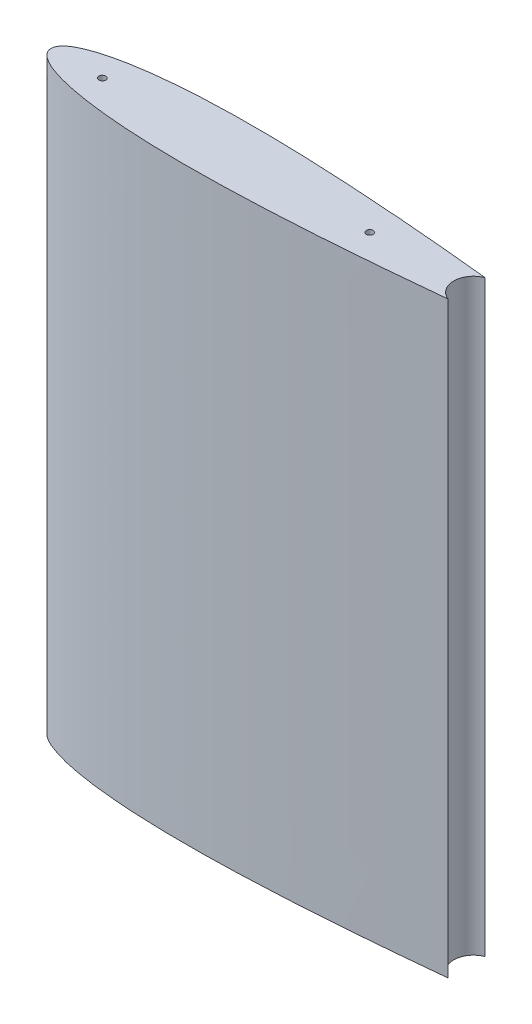
ISO-10303-21;
HEADER;
FILE_DESCRIPTION(('STEP AP214'),'2;1');
FILE_NAME('part.step','',(''),(''),'','','');
FILE_SCHEMA(('AUTOMOTIVE_DESIGN { 1 0 10303 214 1 1 1 1 }'));
ENDSEC;
DATA;
#1=APPLICATION_CONTEXT('core data for automotive mechanical design processes');
#2=APPLICATION_PROTOCOL_DEFINITION('international standard','automotive_design',2000,#1);
#3=PRODUCT_CONTEXT('',#1,'mechanical');
#4=PRODUCT('Part','Part','',(#3));
#5=PRODUCT_RELATED_PRODUCT_CATEGORY('part','',(#4));
#6=PRODUCT_DEFINITION_FORMATION('','',#4);
#7=PRODUCT_DEFINITION_CONTEXT('part definition',#1,'design');
#8=PRODUCT_DEFINITION('design','',#6,#7);
#9=PRODUCT_DEFINITION_SHAPE('','',#8);
#10=(LENGTH_UNIT() NAMED_UNIT(*) SI_UNIT(.MILLI.,.METRE.));
#11=(NAMED_UNIT(*) PLANE_ANGLE_UNIT() SI_UNIT($,.RADIAN.));
#12=(NAMED_UNIT(*) SI_UNIT($,.STERADIAN.) SOLID_ANGLE_UNIT());
#13=UNCERTAINTY_MEASURE_WITH_UNIT(LENGTH_MEASURE(1.E-05),#10,'distance_accuracy_value','');
#14=(GEOMETRIC_REPRESENTATION_CONTEXT(3) GLOBAL_UNCERTAINTY_ASSIGNED_CONTEXT((#13)) GLOBAL_UNIT_ASSIGNED_CONTEXT((#10,
#11,#12)) REPRESENTATION_CONTEXT('',''));
#15=CARTESIAN_POINT('',(0.,0.,0.));
#16=DIRECTION('',(0.,0.,1.));
#17=DIRECTION('',(1.,0.,0.));
#18=AXIS2_PLACEMENT_3D('',#15,#16,#17);
#19=CARTESIAN_POINT('',(0.,-210.,0.));
#20=DIRECTION('',(0.,1.,0.));
#21=DIRECTION('',(0.,0.,1.));
#22=AXIS2_PLACEMENT_3D('',#19,#20,#21);
#23=PLANE('',#22);
#24=CARTESIAN_POINT('',(121.386877654174,-210.,-0.000774738632431499));
#25=DIRECTION('',(0.,1.,0.));
#26=DIRECTION('',(0.,0.,1.));
#27=AXIS2_PLACEMENT_3D('',#24,#25,#26);
#28=CIRCLE('',#27,5.71427999999997);
#29=CARTESIAN_POINT('',(119.387912161681,-210.,5.35246100045289));
#30=VERTEX_POINT('',#29);
#31=CARTESIAN_POINT('',(119.387912161681,-210.,-5.35401047771775));
#32=VERTEX_POINT('',#31);
#33=EDGE_CURVE('E82',#30,#32,#28,.F.);
#34=ORIENTED_EDGE('',*,*,#33,.T.);
#35=CARTESIAN_POINT('',(119.387912161681,-210.,5.35246100045289));
#36=CARTESIAN_POINT('',(83.5761027363663,-210.,9.02159682580074));
#37=CARTESIAN_POINT('',(58.0526817065446,-210.,9.64630087542462));
#38=CARTESIAN_POINT('',(40.3562354993201,-210.,10.079434098306));
#39=CARTESIAN_POINT('',(27.3218192959385,-210.,9.03504536130809));
#40=CARTESIAN_POINT('',(18.4848690393656,-210.,8.32698056014109));
#41=CARTESIAN_POINT('',(12.0944974183857,-210.,6.97651459560746));
#42=CARTESIAN_POINT('',(7.68588439152702,-210.,6.04485017971873));
#43=CARTESIAN_POINT('',(4.71049001401734,-210.,4.86341025976879));
#44=CARTESIAN_POINT('',(-0.754275342115918,-210.,2.69351574302948));
#45=CARTESIAN_POINT('',(-0.755857509541158,-210.,-0.000774738632434628));
#46=CARTESIAN_POINT('',(-0.75743856577784,-210.,-2.69317296494548));
#47=CARTESIAN_POINT('',(4.71049001401745,-210.,-4.86495973703369));
#48=CARTESIAN_POINT('',(7.68309834672846,-210.,-6.04563928713539));
#49=CARTESIAN_POINT('',(12.0944974183858,-210.,-6.97806407287235));
#50=CARTESIAN_POINT('',(18.4819680110596,-210.,-8.32816543573486));
#51=CARTESIAN_POINT('',(27.3218192959386,-210.,-9.03659483857296));
#52=CARTESIAN_POINT('',(40.3533691178668,-210.,-10.0809487265388));
#53=CARTESIAN_POINT('',(58.0526817065449,-210.,-9.64785035268948));
#54=CARTESIAN_POINT('',(83.5741610565001,-210.,-9.02334523988835));
#55=CARTESIAN_POINT('',(119.387912161681,-210.,-5.35401047771775));
#56=B_SPLINE_CURVE_WITH_KNOTS('',2,(#35,#36,#37,#38,#39,#40,#41,#42,#43,#44,#45,#46,#47,#48,#49,
#50,#51,#52,#53,#54,#55),.UNSPECIFIED.,.F.,.F.,(3,2,2,2,2,2,2,2,2,2,3),(0.,0.25,0.375,0.4375,
0.46875,0.5,0.53125,0.5625,0.625,0.75,1.),.UNSPECIFIED.);
#57=EDGE_CURVE('E73',#32,#30,#56,.F.);
#58=ORIENTED_EDGE('',*,*,#57,.T.);
#59=EDGE_LOOP('',(#34,#58));
#60=FACE_BOUND('',#59,.T.);
#61=CARTESIAN_POINT('',(14.0832681871149,-210.,0.));
#62=DIRECTION('',(0.,1.,0.));
#63=DIRECTION('',(0.,0.,1.));
#64=AXIS2_PLACEMENT_3D('',#61,#62,#63);
#65=CIRCLE('',#64,1.);
#66=CARTESIAN_POINT('',(14.0832681871149,-210.,1.));
#67=VERTEX_POINT('',#66);
#68=EDGE_CURVE('E83',#67,#67,#65,.T.);
#69=ORIENTED_EDGE('',*,*,#68,.F.);
#70=EDGE_LOOP('',(#69));
#71=FACE_BOUND('',#70,.T.);
#72=CARTESIAN_POINT('',(91.3868776852961,-210.,0.000591757250574809));
#73=DIRECTION('',(0.,1.,0.));
#74=DIRECTION('',(0.,0.,1.));
#75=AXIS2_PLACEMENT_3D('',#72,#73,#74);
#76=CIRCLE('',#75,0.999999999999998);
#77=CARTESIAN_POINT('',(91.3868776852961,-210.,1.00059175725057));
#78=VERTEX_POINT('',#77);
#79=EDGE_CURVE('E154',#78,#78,#76,.T.);
#80=ORIENTED_EDGE('',*,*,#79,.F.);
#81=EDGE_LOOP('',(#80));
#82=FACE_BOUND('',#81,.T.);
#83=ADVANCED_FACE('F41',(#60,#71,#82),#23,.T.);
#84=CARTESIAN_POINT('',(91.3868776852961,-342.5,0.000591757250574809));
#85=DIRECTION('',(0.,1.,0.));
#86=DIRECTION('',(0.,0.,1.));
#87=AXIS2_PLACEMENT_3D('',#84,#85,#86);
#88=PLANE('',#87);
#89=CARTESIAN_POINT('',(91.3868776852961,-342.5,0.000591757250574809));
#90=DIRECTION('',(0.,1.,0.));
#91=DIRECTION('',(0.,0.,1.));
#92=AXIS2_PLACEMENT_3D('',#89,#90,#91);
#93=CIRCLE('',#92,0.999999999999998);
#94=CARTESIAN_POINT('',(91.3868776852961,-342.5,1.00059175725057));
#95=VERTEX_POINT('',#94);
#96=EDGE_CURVE('E11',#95,#95,#93,.T.);
#97=ORIENTED_EDGE('',*,*,#96,.T.);
#98=EDGE_LOOP('',(#97));
#99=FACE_BOUND('',#98,.T.);
#100=ADVANCED_FACE('F136',(#99),#88,.T.);
#101=CARTESIAN_POINT('',(91.3868776852961,-37.5,0.000591757250574809));
#102=DIRECTION('',(0.,-1.,0.));
#103=DIRECTION('',(0.,0.,-1.));
#104=AXIS2_PLACEMENT_3D('',#101,#102,#103);
#105=CYLINDRICAL_SURFACE('',#104,0.999999999999998);
#106=ORIENTED_EDGE('',*,*,#96,.F.);
#107=EDGE_LOOP('',(#106));
#108=FACE_BOUND('',#107,.T.);
#109=ORIENTED_EDGE('',*,*,#79,.T.);
#110=EDGE_LOOP('',(#109));
#111=FACE_BOUND('',#110,.T.);
#112=ADVANCED_FACE('F139',(#108,#111),#105,.F.);
#113=CARTESIAN_POINT('',(14.0832681871149,-342.5,0.));
#114=DIRECTION('',(0.,1.,0.));
#115=DIRECTION('',(0.,0.,1.));
#116=AXIS2_PLACEMENT_3D('',#113,#114,#115);
#117=PLANE('',#116);
#118=CARTESIAN_POINT('',(14.0832681871149,-342.5,0.));
#119=DIRECTION('',(0.,1.,0.));
#120=DIRECTION('',(0.,0.,1.));
#121=AXIS2_PLACEMENT_3D('',#118,#119,#120);
#122=CIRCLE('',#121,1.);
#123=CARTESIAN_POINT('',(14.0832681871149,-342.5,1.));
#124=VERTEX_POINT('',#123);
#125=EDGE_CURVE('E50',#124,#124,#122,.T.);
#126=ORIENTED_EDGE('',*,*,#125,.T.);
#127=EDGE_LOOP('',(#126));
#128=FACE_BOUND('',#127,.T.);
#129=ADVANCED_FACE('F141',(#128),#117,.T.);
#130=CARTESIAN_POINT('',(14.0832681871149,-37.5,0.));
#131=DIRECTION('',(0.,-1.,0.));
#132=DIRECTION('',(0.,0.,-1.));
#133=AXIS2_PLACEMENT_3D('',#130,#131,#132);
#134=CYLINDRICAL_SURFACE('',#133,1.);
#135=ORIENTED_EDGE('',*,*,#125,.F.);
#136=EDGE_LOOP('',(#135));
#137=FACE_BOUND('',#136,.T.);
#138=ORIENTED_EDGE('',*,*,#68,.T.);
#139=EDGE_LOOP('',(#138));
#140=FACE_BOUND('',#139,.T.);
#141=ADVANCED_FACE('F101',(#137,#140),#134,.F.);
#142=CARTESIAN_POINT('',(91.3868776852961,-375.,0.000591757250574809));
#143=DIRECTION('',(0.,-1.,0.));
#144=DIRECTION('',(0.,0.,1.));
#145=AXIS2_PLACEMENT_3D('',#142,#143,#144);
#146=PLANE('',#145);
#147=CARTESIAN_POINT('',(91.3868776852961,-375.,0.000591757250574809));
#148=DIRECTION('',(0.,1.,0.));
#149=DIRECTION('',(0.,0.,1.));
#150=AXIS2_PLACEMENT_3D('',#147,#148,#149);
#151=CIRCLE('',#150,3.00000000000001);
#152=CARTESIAN_POINT('',(91.3868776852961,-375.,3.00059175725058));
#153=VERTEX_POINT('',#152);
#154=EDGE_CURVE('E163',#153,#153,#151,.T.);
#155=ORIENTED_EDGE('',*,*,#154,.F.);
#156=EDGE_LOOP('',(#155));
#157=FACE_BOUND('',#156,.T.);
#158=ADVANCED_FACE('F131',(#157),#146,.T.);
#159=CARTESIAN_POINT('',(91.3868776852961,-375.,0.000591757250574809));
#160=DIRECTION('',(0.,-1.,0.));
#161=DIRECTION('',(0.,0.,-1.));
#162=AXIS2_PLACEMENT_3D('',#159,#160,#161);
#163=CYLINDRICAL_SURFACE('',#162,3.00000000000001);
#164=ORIENTED_EDGE('',*,*,#154,.T.);
#165=EDGE_LOOP('',(#164));
#166=FACE_BOUND('',#165,.T.);
#167=CARTESIAN_POINT('',(91.3868776852961,-380.,0.000591757250574809));
#168=DIRECTION('',(0.,1.,0.));
#169=DIRECTION('',(0.,0.,1.));
#170=AXIS2_PLACEMENT_3D('',#167,#168,#169);
#171=CIRCLE('',#170,3.00000000000001);
#172=CARTESIAN_POINT('',(91.3868776852961,-380.,3.00059175725058));
#173=VERTEX_POINT('',#172);
#174=EDGE_CURVE('E161',#173,#173,#171,.T.);
#175=ORIENTED_EDGE('',*,*,#174,.F.);
#176=EDGE_LOOP('',(#175));
#177=FACE_BOUND('',#176,.T.);
#178=ADVANCED_FACE('F127',(#166,#177),#163,.F.);
#179=CARTESIAN_POINT('',(-0.755857509541158,-380.,-0.000774738632434628));
#180=DIRECTION('',(0.,1.,0.));
#181=DIRECTION('',(0.,0.,1.));
#182=AXIS2_PLACEMENT_3D('',#179,#180,#181);
#183=PLANE('',#182);
#184=ORIENTED_EDGE('',*,*,#174,.T.);
#185=EDGE_LOOP('',(#184));
#186=FACE_BOUND('',#185,.T.);
#187=CARTESIAN_POINT('',(119.387912161681,-380.,-5.35401047771775));
#188=CARTESIAN_POINT('',(83.5741610565001,-380.,-9.02334523988835));
#189=CARTESIAN_POINT('',(58.0526817065449,-380.,-9.64785035268948));
#190=CARTESIAN_POINT('',(40.3533691178668,-380.,-10.0809487265388));
#191=CARTESIAN_POINT('',(27.3218192959386,-380.,-9.03659483857296));
#192=CARTESIAN_POINT('',(18.4819680110596,-380.,-8.32816543573486));
#193=CARTESIAN_POINT('',(12.0944974183858,-380.,-6.97806407287235));
#194=CARTESIAN_POINT('',(7.68309834672846,-380.,-6.04563928713539));
#195=CARTESIAN_POINT('',(4.71049001401745,-380.,-4.86495973703369));
#196=CARTESIAN_POINT('',(-0.75743856577784,-380.,-2.69317296494548));
#197=CARTESIAN_POINT('',(-0.755857509541158,-380.,-0.000774738632434628));
#198=CARTESIAN_POINT('',(-0.754275342115918,-380.,2.69351574302948));
#199=CARTESIAN_POINT('',(4.71049001401734,-380.,4.86341025976879));
#200=CARTESIAN_POINT('',(7.68588439152702,-380.,6.04485017971873));
#201=CARTESIAN_POINT('',(12.0944974183857,-380.,6.97651459560746));
#202=CARTESIAN_POINT('',(18.4848690393656,-380.,8.32698056014109));
#203=CARTESIAN_POINT('',(27.3218192959385,-380.,9.03504536130809));
#204=CARTESIAN_POINT('',(40.3562354993201,-380.,10.079434098306));
#205=CARTESIAN_POINT('',(58.0526817065446,-380.,9.64630087542462));
#206=CARTESIAN_POINT('',(83.5761027363663,-380.,9.02159682580074));
#207=CARTESIAN_POINT('',(119.387912161681,-380.,5.35246100045289));
#208=B_SPLINE_CURVE_WITH_KNOTS('',2,(#187,#188,#189,#190,#191,#192,#193,#194,#195,#196,#197,
#198,#199,#200,#201,#202,#203,#204,#205,#206,#207),.UNSPECIFIED.,.F.,.F.,(3,2,2,2,2,2,2,2,2,2,
3),(0.,0.25,0.375,0.4375,0.46875,0.5,0.53125,0.5625,0.625,0.75,1.),.UNSPECIFIED.);
#209=CARTESIAN_POINT('',(119.387912161681,-380.,5.35246100045289));
#210=VERTEX_POINT('',#209);
#211=CARTESIAN_POINT('',(119.387912161681,-380.,-5.35401047771775));
#212=VERTEX_POINT('',#211);
#213=EDGE_CURVE('E75',#210,#212,#208,.F.);
#214=ORIENTED_EDGE('',*,*,#213,.T.);
#215=CARTESIAN_POINT('',(121.386877654174,-380.,-0.000774738632431499));
#216=DIRECTION('',(0.,1.,0.));
#217=DIRECTION('',(0.,0.,-1.));
#218=AXIS2_PLACEMENT_3D('',#215,#216,#217);
#219=CIRCLE('',#218,5.71427999999997);
#220=EDGE_CURVE('E58',#212,#210,#219,.T.);
#221=ORIENTED_EDGE('',*,*,#220,.T.);
#222=EDGE_LOOP('',(#214,#221));
#223=FACE_BOUND('',#222,.T.);
#224=ADVANCED_FACE('F100',(#186,#223),#183,.F.);
#225=CARTESIAN_POINT('',(119.387912161681,-380.,5.35246100045289));
#226=CARTESIAN_POINT('',(83.5761027363663,-380.,9.02159682580074));
#227=CARTESIAN_POINT('',(58.0526817065446,-380.,9.64630087542462));
#228=CARTESIAN_POINT('',(40.3562354993201,-380.,10.079434098306));
#229=CARTESIAN_POINT('',(27.3218192959385,-380.,9.03504536130809));
#230=CARTESIAN_POINT('',(18.4848690393656,-380.,8.32698056014109));
#231=CARTESIAN_POINT('',(12.0944974183857,-380.,6.97651459560746));
#232=CARTESIAN_POINT('',(7.68588439152702,-380.,6.04485017971873));
#233=CARTESIAN_POINT('',(4.71049001401734,-380.,4.86341025976879));
#234=CARTESIAN_POINT('',(-0.754275342115918,-380.,2.69351574302948));
#235=CARTESIAN_POINT('',(-0.755857509541158,-380.,-0.000774738632434628));
#236=CARTESIAN_POINT('',(-0.75743856577784,-380.,-2.69317296494548));
#237=CARTESIAN_POINT('',(4.71049001401745,-380.,-4.86495973703369));
#238=CARTESIAN_POINT('',(7.68309834672846,-380.,-6.04563928713539));
#239=CARTESIAN_POINT('',(12.0944974183858,-380.,-6.97806407287235));
#240=CARTESIAN_POINT('',(18.4819680110596,-380.,-8.32816543573486));
#241=CARTESIAN_POINT('',(27.3218192959386,-380.,-9.03659483857296));
#242=CARTESIAN_POINT('',(40.3533691178668,-380.,-10.0809487265388));
#243=CARTESIAN_POINT('',(58.0526817065449,-380.,-9.64785035268948));
#244=CARTESIAN_POINT('',(83.5741610565001,-380.,-9.02334523988835));
#245=CARTESIAN_POINT('',(119.387912161681,-380.,-5.35401047771775));
#246=B_SPLINE_CURVE_WITH_KNOTS('',2,(#225,#226,#227,#228,#229,#230,#231,#232,#233,#234,#235,
#236,#237,#238,#239,#240,#241,#242,#243,#244,#245),.UNSPECIFIED.,.F.,.F.,(3,2,2,2,2,2,2,2,2,2,
3),(0.,0.25,0.375,0.4375,0.46875,0.5,0.53125,0.5625,0.625,0.75,1.),.UNSPECIFIED.);
#247=DIRECTION('',(0.,1.,0.));
#248=VECTOR('',#247,1.);
#249=SURFACE_OF_LINEAR_EXTRUSION('',#246,#248);
#250=ORIENTED_EDGE('',*,*,#57,.F.);
#251=DIRECTION('',(0.,1.,0.));
#252=VECTOR('',#251,1.);
#253=CARTESIAN_POINT('',(119.387912161681,-380.,-5.35401047771775));
#254=LINE('',#253,#252);
#255=EDGE_CURVE('E78',#212,#32,#254,.T.);
#256=ORIENTED_EDGE('',*,*,#255,.F.);
#257=ORIENTED_EDGE('',*,*,#213,.F.);
#258=DIRECTION('',(0.,1.,0.));
#259=VECTOR('',#258,1.);
#260=CARTESIAN_POINT('',(119.387912161681,-380.,5.35246100045289));
#261=LINE('',#260,#259);
#262=EDGE_CURVE('E69',#210,#30,#261,.T.);
#263=ORIENTED_EDGE('',*,*,#262,.T.);
#264=EDGE_LOOP('',(#250,#256,#257,#263));
#265=FACE_BOUND('',#264,.T.);
#266=ADVANCED_FACE('F71',(#265),#249,.F.);
#267=CARTESIAN_POINT('',(121.386877654174,-380.,-0.000774738632431499));
#268=DIRECTION('',(0.,1.,0.));
#269=DIRECTION('',(0.,0.,1.));
#270=AXIS2_PLACEMENT_3D('',#267,#268,#269);
#271=CYLINDRICAL_SURFACE('',#270,5.71427999999997);
#272=ORIENTED_EDGE('',*,*,#33,.F.);
#273=ORIENTED_EDGE('',*,*,#262,.F.);
#274=ORIENTED_EDGE('',*,*,#220,.F.);
#275=ORIENTED_EDGE('',*,*,#255,.T.);
#276=EDGE_LOOP('',(#272,#273,#274,#275));
#277=FACE_BOUND('',#276,.T.);
#278=ADVANCED_FACE('F43',(#277),#271,.F.);
#279=CLOSED_SHELL('',(#83,#100,#112,#129,#141,#158,#178,#224,#266,#278));
#280=MANIFOLD_SOLID_BREP('B2',#279);
#281=ADVANCED_BREP_SHAPE_REPRESENTATION('',(#18,#280),#14);
#282=SHAPE_DEFINITION_REPRESENTATION(#9,#281);
ENDSEC;
END-ISO-10303-21;
